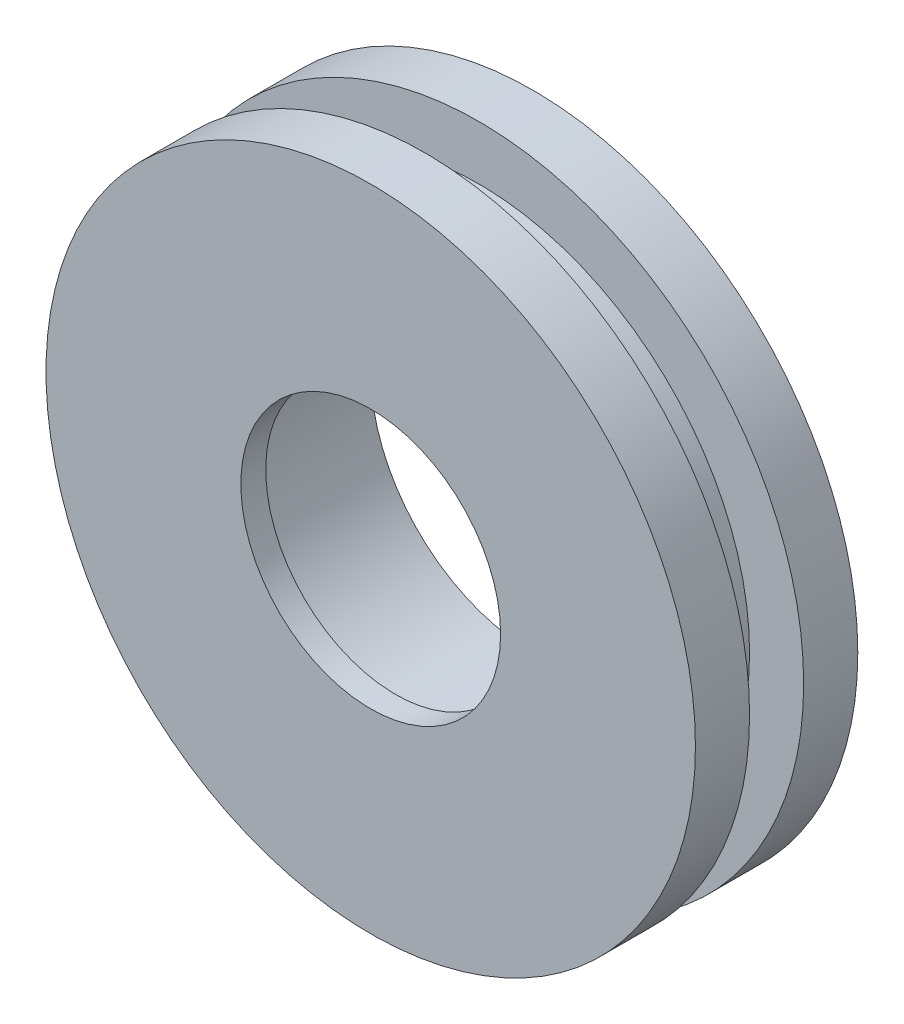
ISO-10303-21;
HEADER;
FILE_DESCRIPTION(('STEP AP214'),'2;1');
FILE_NAME('part.step','',(''),(''),'','','');
FILE_SCHEMA(('AUTOMOTIVE_DESIGN { 1 0 10303 214 1 1 1 1 }'));
ENDSEC;
DATA;
#1=APPLICATION_CONTEXT('core data for automotive mechanical design processes');
#2=APPLICATION_PROTOCOL_DEFINITION('international standard','automotive_design',2000,#1);
#3=PRODUCT_CONTEXT('',#1,'mechanical');
#4=PRODUCT('Part','Part','',(#3));
#5=PRODUCT_RELATED_PRODUCT_CATEGORY('part','',(#4));
#6=PRODUCT_DEFINITION_FORMATION('','',#4);
#7=PRODUCT_DEFINITION_CONTEXT('part definition',#1,'design');
#8=PRODUCT_DEFINITION('design','',#6,#7);
#9=PRODUCT_DEFINITION_SHAPE('','',#8);
#10=(LENGTH_UNIT() NAMED_UNIT(*) SI_UNIT(.MILLI.,.METRE.));
#11=(NAMED_UNIT(*) PLANE_ANGLE_UNIT() SI_UNIT($,.RADIAN.));
#12=(NAMED_UNIT(*) SI_UNIT($,.STERADIAN.) SOLID_ANGLE_UNIT());
#13=UNCERTAINTY_MEASURE_WITH_UNIT(LENGTH_MEASURE(1.E-05),#10,'distance_accuracy_value','');
#14=(GEOMETRIC_REPRESENTATION_CONTEXT(3) GLOBAL_UNCERTAINTY_ASSIGNED_CONTEXT((#13)) GLOBAL_UNIT_ASSIGNED_CONTEXT((#10,
#11,#12)) REPRESENTATION_CONTEXT('',''));
#15=CARTESIAN_POINT('',(0.,0.,0.));
#16=DIRECTION('',(0.,0.,1.));
#17=DIRECTION('',(1.,0.,0.));
#18=AXIS2_PLACEMENT_3D('',#15,#16,#17);
#19=CARTESIAN_POINT('',(0.,7.93750000000001,-0.793750000000001));
#20=DIRECTION('',(0.,0.,-1.));
#21=DIRECTION('',(-1.,0.,0.));
#22=AXIS2_PLACEMENT_3D('',#19,#20,#21);
#23=PLANE('',#22);
#24=CARTESIAN_POINT('',(0.,0.,-0.793750000000001));
#25=DIRECTION('',(0.,0.,1.));
#26=DIRECTION('',(1.,0.,0.));
#27=AXIS2_PLACEMENT_3D('',#24,#25,#26);
#28=CIRCLE('',#27,7.93750000000001);
#29=CARTESIAN_POINT('',(7.93750000000001,0.,-0.793750000000001));
#30=VERTEX_POINT('',#29);
#31=EDGE_CURVE('E12',#30,#30,#28,.T.);
#32=ORIENTED_EDGE('',*,*,#31,.F.);
#33=EDGE_LOOP('',(#32));
#34=FACE_BOUND('',#33,.T.);
#35=CARTESIAN_POINT('',(0.,0.,-0.793750000000001));
#36=DIRECTION('',(0.,0.,1.));
#37=DIRECTION('',(1.,0.,0.));
#38=AXIS2_PLACEMENT_3D('',#35,#36,#37);
#39=CIRCLE('',#38,9.525);
#40=CARTESIAN_POINT('',(9.525,0.,-0.793750000000001));
#41=VERTEX_POINT('',#40);
#42=EDGE_CURVE('E77',#41,#41,#39,.T.);
#43=ORIENTED_EDGE('',*,*,#42,.T.);
#44=EDGE_LOOP('',(#43));
#45=FACE_BOUND('',#44,.T.);
#46=ADVANCED_FACE('F43',(#34,#45),#23,.F.);
#47=CARTESIAN_POINT('',(0.,0.,9.16579044751488));
#48=DIRECTION('',(0.,0.,1.));
#49=DIRECTION('',(1.,0.,0.));
#50=AXIS2_PLACEMENT_3D('',#47,#48,#49);
#51=CYLINDRICAL_SURFACE('',#50,7.9375);
#52=CARTESIAN_POINT('',(0.,0.,0.793749999999999));
#53=DIRECTION('',(0.,0.,1.));
#54=DIRECTION('',(1.,0.,0.));
#55=AXIS2_PLACEMENT_3D('',#52,#53,#54);
#56=CIRCLE('',#55,7.93749999999999);
#57=CARTESIAN_POINT('',(7.93749999999999,0.,0.793749999999999));
#58=VERTEX_POINT('',#57);
#59=EDGE_CURVE('E49',#58,#58,#56,.T.);
#60=ORIENTED_EDGE('',*,*,#59,.F.);
#61=EDGE_LOOP('',(#60));
#62=FACE_BOUND('',#61,.T.);
#63=ORIENTED_EDGE('',*,*,#31,.T.);
#64=EDGE_LOOP('',(#63));
#65=FACE_BOUND('',#64,.T.);
#66=ADVANCED_FACE('F126',(#62,#65),#51,.T.);
#67=CARTESIAN_POINT('',(0.,9.525,0.793749999999999));
#68=DIRECTION('',(0.,0.,1.));
#69=DIRECTION('',(1.,0.,0.));
#70=AXIS2_PLACEMENT_3D('',#67,#68,#69);
#71=PLANE('',#70);
#72=CARTESIAN_POINT('',(0.,0.,0.793749999999999));
#73=DIRECTION('',(0.,0.,1.));
#74=DIRECTION('',(1.,0.,0.));
#75=AXIS2_PLACEMENT_3D('',#72,#73,#74);
#76=CIRCLE('',#75,9.525);
#77=CARTESIAN_POINT('',(9.525,0.,0.793749999999999));
#78=VERTEX_POINT('',#77);
#79=EDGE_CURVE('E53',#78,#78,#76,.T.);
#80=ORIENTED_EDGE('',*,*,#79,.F.);
#81=EDGE_LOOP('',(#80));
#82=FACE_BOUND('',#81,.T.);
#83=ORIENTED_EDGE('',*,*,#59,.T.);
#84=EDGE_LOOP('',(#83));
#85=FACE_BOUND('',#84,.T.);
#86=ADVANCED_FACE('F121',(#82,#85),#71,.F.);
#87=CARTESIAN_POINT('',(0.,0.,9.16579044751488));
#88=DIRECTION('',(0.,0.,1.));
#89=DIRECTION('',(1.,0.,0.));
#90=AXIS2_PLACEMENT_3D('',#87,#88,#89);
#91=CYLINDRICAL_SURFACE('',#90,9.525);
#92=CARTESIAN_POINT('',(0.,0.,2.38125));
#93=DIRECTION('',(0.,0.,1.));
#94=DIRECTION('',(1.,0.,0.));
#95=AXIS2_PLACEMENT_3D('',#92,#93,#94);
#96=CIRCLE('',#95,9.525);
#97=CARTESIAN_POINT('',(9.525,0.,2.38125));
#98=VERTEX_POINT('',#97);
#99=EDGE_CURVE('E57',#98,#98,#96,.T.);
#100=ORIENTED_EDGE('',*,*,#99,.F.);
#101=EDGE_LOOP('',(#100));
#102=FACE_BOUND('',#101,.T.);
#103=ORIENTED_EDGE('',*,*,#79,.T.);
#104=EDGE_LOOP('',(#103));
#105=FACE_BOUND('',#104,.T.);
#106=ADVANCED_FACE('F115',(#102,#105),#91,.T.);
#107=CARTESIAN_POINT('',(0.,9.525,2.38125));
#108=DIRECTION('',(0.,0.,-1.));
#109=DIRECTION('',(-1.,0.,0.));
#110=AXIS2_PLACEMENT_3D('',#107,#108,#109);
#111=PLANE('',#110);
#112=CARTESIAN_POINT('',(0.,0.,2.38125));
#113=DIRECTION('',(0.,0.,1.));
#114=DIRECTION('',(1.,0.,0.));
#115=AXIS2_PLACEMENT_3D('',#112,#113,#114);
#116=CIRCLE('',#115,3.81);
#117=CARTESIAN_POINT('',(3.81,0.,2.38125));
#118=VERTEX_POINT('',#117);
#119=EDGE_CURVE('E62',#118,#118,#116,.T.);
#120=ORIENTED_EDGE('',*,*,#119,.F.);
#121=EDGE_LOOP('',(#120));
#122=FACE_BOUND('',#121,.T.);
#123=ORIENTED_EDGE('',*,*,#99,.T.);
#124=EDGE_LOOP('',(#123));
#125=FACE_BOUND('',#124,.T.);
#126=ADVANCED_FACE('F109',(#122,#125),#111,.F.);
#127=CARTESIAN_POINT('',(0.,0.,9.16579044751488));
#128=DIRECTION('',(0.,0.,1.));
#129=DIRECTION('',(1.,0.,0.));
#130=AXIS2_PLACEMENT_3D('',#127,#128,#129);
#131=CYLINDRICAL_SURFACE('',#130,3.81);
#132=CARTESIAN_POINT('',(0.,0.,1.651));
#133=DIRECTION('',(0.,0.,1.));
#134=DIRECTION('',(1.,0.,0.));
#135=AXIS2_PLACEMENT_3D('',#132,#133,#134);
#136=CIRCLE('',#135,3.81);
#137=CARTESIAN_POINT('',(3.81,0.,1.651));
#138=VERTEX_POINT('',#137);
#139=EDGE_CURVE('E65',#138,#138,#136,.T.);
#140=ORIENTED_EDGE('',*,*,#139,.F.);
#141=EDGE_LOOP('',(#140));
#142=FACE_BOUND('',#141,.T.);
#143=ORIENTED_EDGE('',*,*,#119,.T.);
#144=EDGE_LOOP('',(#143));
#145=FACE_BOUND('',#144,.T.);
#146=ADVANCED_FACE('F103',(#142,#145),#131,.F.);
#147=CARTESIAN_POINT('',(0.,3.81,1.651));
#148=DIRECTION('',(0.,0.,1.));
#149=DIRECTION('',(1.,0.,0.));
#150=AXIS2_PLACEMENT_3D('',#147,#148,#149);
#151=PLANE('',#150);
#152=CARTESIAN_POINT('',(0.,0.,1.651));
#153=DIRECTION('',(0.,0.,1.));
#154=DIRECTION('',(1.,0.,0.));
#155=AXIS2_PLACEMENT_3D('',#152,#153,#154);
#156=CIRCLE('',#155,4.7625);
#157=CARTESIAN_POINT('',(4.7625,0.,1.651));
#158=VERTEX_POINT('',#157);
#159=EDGE_CURVE('E68',#158,#158,#156,.T.);
#160=ORIENTED_EDGE('',*,*,#159,.F.);
#161=EDGE_LOOP('',(#160));
#162=FACE_BOUND('',#161,.T.);
#163=ORIENTED_EDGE('',*,*,#139,.T.);
#164=EDGE_LOOP('',(#163));
#165=FACE_BOUND('',#164,.T.);
#166=ADVANCED_FACE('F97',(#162,#165),#151,.F.);
#167=CARTESIAN_POINT('',(0.,0.,9.16579044751488));
#168=DIRECTION('',(0.,0.,1.));
#169=DIRECTION('',(1.,0.,0.));
#170=AXIS2_PLACEMENT_3D('',#167,#168,#169);
#171=CYLINDRICAL_SURFACE('',#170,4.7625);
#172=CARTESIAN_POINT('',(0.,0.,-2.38125));
#173=DIRECTION('',(0.,0.,1.));
#174=DIRECTION('',(1.,0.,0.));
#175=AXIS2_PLACEMENT_3D('',#172,#173,#174);
#176=CIRCLE('',#175,4.7625);
#177=CARTESIAN_POINT('',(4.7625,0.,-2.38125));
#178=VERTEX_POINT('',#177);
#179=EDGE_CURVE('E71',#178,#178,#176,.T.);
#180=ORIENTED_EDGE('',*,*,#179,.F.);
#181=EDGE_LOOP('',(#180));
#182=FACE_BOUND('',#181,.T.);
#183=ORIENTED_EDGE('',*,*,#159,.T.);
#184=EDGE_LOOP('',(#183));
#185=FACE_BOUND('',#184,.T.);
#186=ADVANCED_FACE('F91',(#182,#185),#171,.F.);
#187=CARTESIAN_POINT('',(0.,9.525,-2.38125));
#188=DIRECTION('',(0.,0.,1.));
#189=DIRECTION('',(1.,0.,0.));
#190=AXIS2_PLACEMENT_3D('',#187,#188,#189);
#191=PLANE('',#190);
#192=CARTESIAN_POINT('',(0.,0.,-2.38125));
#193=DIRECTION('',(0.,0.,1.));
#194=DIRECTION('',(1.,0.,0.));
#195=AXIS2_PLACEMENT_3D('',#192,#193,#194);
#196=CIRCLE('',#195,9.525);
#197=CARTESIAN_POINT('',(9.525,0.,-2.38125));
#198=VERTEX_POINT('',#197);
#199=EDGE_CURVE('E74',#198,#198,#196,.T.);
#200=ORIENTED_EDGE('',*,*,#199,.F.);
#201=EDGE_LOOP('',(#200));
#202=FACE_BOUND('',#201,.T.);
#203=ORIENTED_EDGE('',*,*,#179,.T.);
#204=EDGE_LOOP('',(#203));
#205=FACE_BOUND('',#204,.T.);
#206=ADVANCED_FACE('F85',(#202,#205),#191,.F.);
#207=CARTESIAN_POINT('',(0.,0.,9.16579044751488));
#208=DIRECTION('',(0.,0.,1.));
#209=DIRECTION('',(1.,0.,0.));
#210=AXIS2_PLACEMENT_3D('',#207,#208,#209);
#211=CYLINDRICAL_SURFACE('',#210,9.525);
#212=ORIENTED_EDGE('',*,*,#42,.F.);
#213=EDGE_LOOP('',(#212));
#214=FACE_BOUND('',#213,.T.);
#215=ORIENTED_EDGE('',*,*,#199,.T.);
#216=EDGE_LOOP('',(#215));
#217=FACE_BOUND('',#216,.T.);
#218=ADVANCED_FACE('F82',(#214,#217),#211,.T.);
#219=CLOSED_SHELL('',(#46,#66,#86,#106,#126,#146,#166,#186,#206,#218));
#220=MANIFOLD_SOLID_BREP('B2',#219);
#221=ADVANCED_BREP_SHAPE_REPRESENTATION('',(#18,#220),#14);
#222=SHAPE_DEFINITION_REPRESENTATION(#9,#221);
ENDSEC;
END-ISO-10303-21;
